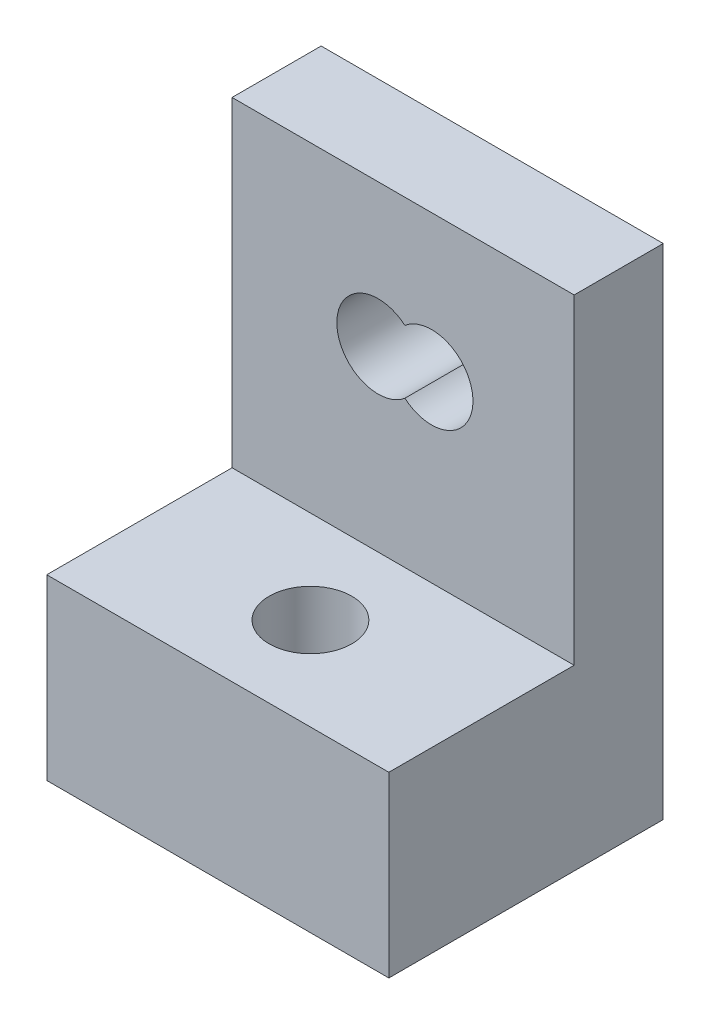
ISO-10303-21;
HEADER;
FILE_DESCRIPTION(('STEP AP214'),'2;1');
FILE_NAME('part.step','',(''),(''),'','','');
FILE_SCHEMA(('AUTOMOTIVE_DESIGN { 1 0 10303 214 1 1 1 1 }'));
ENDSEC;
DATA;
#1=APPLICATION_CONTEXT('core data for automotive mechanical design processes');
#2=APPLICATION_PROTOCOL_DEFINITION('international standard','automotive_design',2000,#1);
#3=PRODUCT_CONTEXT('',#1,'mechanical');
#4=PRODUCT('Part','Part','',(#3));
#5=PRODUCT_RELATED_PRODUCT_CATEGORY('part','',(#4));
#6=PRODUCT_DEFINITION_FORMATION('','',#4);
#7=PRODUCT_DEFINITION_CONTEXT('part definition',#1,'design');
#8=PRODUCT_DEFINITION('design','',#6,#7);
#9=PRODUCT_DEFINITION_SHAPE('','',#8);
#10=(LENGTH_UNIT() NAMED_UNIT(*) SI_UNIT(.MILLI.,.METRE.));
#11=(NAMED_UNIT(*) PLANE_ANGLE_UNIT() SI_UNIT($,.RADIAN.));
#12=(NAMED_UNIT(*) SI_UNIT($,.STERADIAN.) SOLID_ANGLE_UNIT());
#13=UNCERTAINTY_MEASURE_WITH_UNIT(LENGTH_MEASURE(1.E-05),#10,'distance_accuracy_value','');
#14=(GEOMETRIC_REPRESENTATION_CONTEXT(3) GLOBAL_UNCERTAINTY_ASSIGNED_CONTEXT((#13)) GLOBAL_UNIT_ASSIGNED_CONTEXT((#10,
#11,#12)) REPRESENTATION_CONTEXT('',''));
#15=CARTESIAN_POINT('',(0.,0.,0.));
#16=DIRECTION('',(0.,0.,1.));
#17=DIRECTION('',(1.,0.,0.));
#18=AXIS2_PLACEMENT_3D('',#15,#16,#17);
#19=CARTESIAN_POINT('',(0.,6.35,0.));
#20=DIRECTION('',(0.,-1.,0.));
#21=DIRECTION('',(0.,0.,-1.));
#22=AXIS2_PLACEMENT_3D('',#19,#20,#21);
#23=PLANE('',#22);
#24=CARTESIAN_POINT('',(6.096,6.35,-3.302));
#25=DIRECTION('',(0.,1.,0.));
#26=DIRECTION('',(0.,0.,1.));
#27=AXIS2_PLACEMENT_3D('',#24,#25,#26);
#28=CIRCLE('',#27,1.4732);
#29=CARTESIAN_POINT('',(6.096,6.35,-1.8288));
#30=VERTEX_POINT('',#29);
#31=EDGE_CURVE('E130',#30,#30,#28,.T.);
#32=ORIENTED_EDGE('',*,*,#31,.F.);
#33=EDGE_LOOP('',(#32));
#34=FACE_BOUND('',#33,.T.);
#35=DIRECTION('',(1.,0.,0.));
#36=VECTOR('',#35,1.);
#37=CARTESIAN_POINT('',(0.,6.35,-6.604));
#38=LINE('',#37,#36);
#39=CARTESIAN_POINT('',(0.,6.35,-6.604));
#40=VERTEX_POINT('',#39);
#41=CARTESIAN_POINT('',(12.192,6.35,-6.604));
#42=VERTEX_POINT('',#41);
#43=EDGE_CURVE('E70',#40,#42,#38,.T.);
#44=ORIENTED_EDGE('',*,*,#43,.F.);
#45=DIRECTION('',(0.,0.,1.));
#46=VECTOR('',#45,1.);
#47=CARTESIAN_POINT('',(0.,6.35,0.));
#48=LINE('',#47,#46);
#49=CARTESIAN_POINT('',(0.,6.35,0.));
#50=VERTEX_POINT('',#49);
#51=EDGE_CURVE('E154',#40,#50,#48,.T.);
#52=ORIENTED_EDGE('',*,*,#51,.T.);
#53=DIRECTION('',(1.,0.,0.));
#54=VECTOR('',#53,1.);
#55=CARTESIAN_POINT('',(0.,6.35,0.));
#56=LINE('',#55,#54);
#57=CARTESIAN_POINT('',(12.192,6.35,0.));
#58=VERTEX_POINT('',#57);
#59=EDGE_CURVE('E156',#50,#58,#56,.T.);
#60=ORIENTED_EDGE('',*,*,#59,.T.);
#61=DIRECTION('',(0.,0.,-1.));
#62=VECTOR('',#61,1.);
#63=CARTESIAN_POINT('',(12.192,6.35,0.));
#64=LINE('',#63,#62);
#65=EDGE_CURVE('E159',#58,#42,#64,.T.);
#66=ORIENTED_EDGE('',*,*,#65,.T.);
#67=EDGE_LOOP('',(#44,#52,#60,#66));
#68=FACE_BOUND('',#67,.T.);
#69=ADVANCED_FACE('F47',(#34,#68),#23,.F.);
#70=CARTESIAN_POINT('',(0.,6.35,0.));
#71=DIRECTION('',(1.,0.,0.));
#72=DIRECTION('',(0.,0.,-1.));
#73=AXIS2_PLACEMENT_3D('',#70,#71,#72);
#74=PLANE('',#73);
#75=DIRECTION('',(0.,0.,1.));
#76=VECTOR('',#75,1.);
#77=CARTESIAN_POINT('',(0.,0.,0.));
#78=LINE('',#77,#76);
#79=CARTESIAN_POINT('',(0.,0.,-9.779));
#80=VERTEX_POINT('',#79);
#81=CARTESIAN_POINT('',(0.,0.,0.));
#82=VERTEX_POINT('',#81);
#83=EDGE_CURVE('E153',#80,#82,#78,.T.);
#84=ORIENTED_EDGE('',*,*,#83,.T.);
#85=DIRECTION('',(0.,-1.,0.));
#86=VECTOR('',#85,1.);
#87=CARTESIAN_POINT('',(0.,6.35,0.));
#88=LINE('',#87,#86);
#89=EDGE_CURVE('E116',#50,#82,#88,.T.);
#90=ORIENTED_EDGE('',*,*,#89,.F.);
#91=ORIENTED_EDGE('',*,*,#51,.F.);
#92=DIRECTION('',(0.,-1.,0.));
#93=VECTOR('',#92,1.);
#94=CARTESIAN_POINT('',(0.,17.78,-6.604));
#95=LINE('',#94,#93);
#96=CARTESIAN_POINT('',(0.,17.78,-6.604));
#97=VERTEX_POINT('',#96);
#98=EDGE_CURVE('E150',#97,#40,#95,.T.);
#99=ORIENTED_EDGE('',*,*,#98,.F.);
#100=DIRECTION('',(0.,0.,1.));
#101=VECTOR('',#100,1.);
#102=CARTESIAN_POINT('',(0.,17.78,-9.779));
#103=LINE('',#102,#101);
#104=CARTESIAN_POINT('',(0.,17.78,-9.779));
#105=VERTEX_POINT('',#104);
#106=EDGE_CURVE('E135',#105,#97,#103,.T.);
#107=ORIENTED_EDGE('',*,*,#106,.F.);
#108=DIRECTION('',(0.,-1.,0.));
#109=VECTOR('',#108,1.);
#110=CARTESIAN_POINT('',(0.,6.35,-9.779));
#111=LINE('',#110,#109);
#112=EDGE_CURVE('E161',#105,#80,#111,.T.);
#113=ORIENTED_EDGE('',*,*,#112,.T.);
#114=EDGE_LOOP('',(#84,#90,#91,#99,#107,#113));
#115=FACE_BOUND('',#114,.T.);
#116=ADVANCED_FACE('F49',(#115),#74,.F.);
#117=CARTESIAN_POINT('',(0.,6.35,0.));
#118=DIRECTION('',(0.,0.,-1.));
#119=DIRECTION('',(-1.,0.,0.));
#120=AXIS2_PLACEMENT_3D('',#117,#118,#119);
#121=PLANE('',#120);
#122=DIRECTION('',(1.,0.,0.));
#123=VECTOR('',#122,1.);
#124=CARTESIAN_POINT('',(0.,0.,0.));
#125=LINE('',#124,#123);
#126=CARTESIAN_POINT('',(12.192,0.,0.));
#127=VERTEX_POINT('',#126);
#128=EDGE_CURVE('E164',#82,#127,#125,.T.);
#129=ORIENTED_EDGE('',*,*,#128,.T.);
#130=DIRECTION('',(0.,-1.,0.));
#131=VECTOR('',#130,1.);
#132=CARTESIAN_POINT('',(12.192,6.35,0.));
#133=LINE('',#132,#131);
#134=EDGE_CURVE('E174',#58,#127,#133,.T.);
#135=ORIENTED_EDGE('',*,*,#134,.F.);
#136=ORIENTED_EDGE('',*,*,#59,.F.);
#137=ORIENTED_EDGE('',*,*,#89,.T.);
#138=EDGE_LOOP('',(#129,#135,#136,#137));
#139=FACE_BOUND('',#138,.T.);
#140=ADVANCED_FACE('F181',(#139),#121,.F.);
#141=CARTESIAN_POINT('',(12.192,6.35,0.));
#142=DIRECTION('',(-1.,0.,0.));
#143=DIRECTION('',(0.,0.,1.));
#144=AXIS2_PLACEMENT_3D('',#141,#142,#143);
#145=PLANE('',#144);
#146=DIRECTION('',(0.,0.,-1.));
#147=VECTOR('',#146,1.);
#148=CARTESIAN_POINT('',(12.192,0.,0.));
#149=LINE('',#148,#147);
#150=CARTESIAN_POINT('',(12.192,0.,-9.779));
#151=VERTEX_POINT('',#150);
#152=EDGE_CURVE('E166',#127,#151,#149,.T.);
#153=ORIENTED_EDGE('',*,*,#152,.T.);
#154=DIRECTION('',(0.,-1.,0.));
#155=VECTOR('',#154,1.);
#156=CARTESIAN_POINT('',(12.192,6.35,-9.779));
#157=LINE('',#156,#155);
#158=CARTESIAN_POINT('',(12.192,17.78,-9.779));
#159=VERTEX_POINT('',#158);
#160=EDGE_CURVE('E171',#159,#151,#157,.T.);
#161=ORIENTED_EDGE('',*,*,#160,.F.);
#162=DIRECTION('',(0.,0.,-1.));
#163=VECTOR('',#162,1.);
#164=CARTESIAN_POINT('',(12.192,17.78,-9.779));
#165=LINE('',#164,#163);
#166=CARTESIAN_POINT('',(12.192,17.78,-6.604));
#167=VERTEX_POINT('',#166);
#168=EDGE_CURVE('E140',#167,#159,#165,.T.);
#169=ORIENTED_EDGE('',*,*,#168,.F.);
#170=DIRECTION('',(0.,-1.,0.));
#171=VECTOR('',#170,1.);
#172=CARTESIAN_POINT('',(12.192,17.78,-6.604));
#173=LINE('',#172,#171);
#174=EDGE_CURVE('E146',#167,#42,#173,.T.);
#175=ORIENTED_EDGE('',*,*,#174,.T.);
#176=ORIENTED_EDGE('',*,*,#65,.F.);
#177=ORIENTED_EDGE('',*,*,#134,.T.);
#178=EDGE_LOOP('',(#153,#161,#169,#175,#176,#177));
#179=FACE_BOUND('',#178,.T.);
#180=ADVANCED_FACE('F191',(#179),#145,.F.);
#181=CARTESIAN_POINT('',(0.,6.35,-9.779));
#182=DIRECTION('',(0.,0.,1.));
#183=DIRECTION('',(1.,0.,0.));
#184=AXIS2_PLACEMENT_3D('',#181,#182,#183);
#185=PLANE('',#184);
#186=CARTESIAN_POINT('',(5.20700000000436,12.6999999999921,-9.779));
#187=DIRECTION('',(0.,0.,-1.));
#188=DIRECTION('',(-1.,0.,0.));
#189=AXIS2_PLACEMENT_3D('',#186,#187,#188);
#190=CIRCLE('',#189,1.4732);
#191=CARTESIAN_POINT('',(6.1595000000038,11.576139692836,-9.779));
#192=VERTEX_POINT('',#191);
#193=CARTESIAN_POINT('',(6.1595000000051,13.8238603071471,-9.779));
#194=VERTEX_POINT('',#193);
#195=EDGE_CURVE('E121',#192,#194,#190,.T.);
#196=ORIENTED_EDGE('',*,*,#195,.F.);
#197=CARTESIAN_POINT('',(7.11200000000454,12.699999999991,-9.779));
#198=DIRECTION('',(0.,0.,-1.));
#199=DIRECTION('',(-1.,0.,0.));
#200=AXIS2_PLACEMENT_3D('',#197,#198,#199);
#201=CIRCLE('',#200,1.4732);
#202=EDGE_CURVE('E111',#194,#192,#201,.T.);
#203=ORIENTED_EDGE('',*,*,#202,.F.);
#204=EDGE_LOOP('',(#196,#203));
#205=FACE_BOUND('',#204,.T.);
#206=DIRECTION('',(-1.,0.,0.));
#207=VECTOR('',#206,1.);
#208=CARTESIAN_POINT('',(0.,0.,-9.779));
#209=LINE('',#208,#207);
#210=EDGE_CURVE('E157',#151,#80,#209,.T.);
#211=ORIENTED_EDGE('',*,*,#210,.T.);
#212=ORIENTED_EDGE('',*,*,#112,.F.);
#213=DIRECTION('',(-1.,0.,0.));
#214=VECTOR('',#213,1.);
#215=CARTESIAN_POINT('',(0.,17.78,-9.779));
#216=LINE('',#215,#214);
#217=EDGE_CURVE('E143',#159,#105,#216,.T.);
#218=ORIENTED_EDGE('',*,*,#217,.F.);
#219=ORIENTED_EDGE('',*,*,#160,.T.);
#220=EDGE_LOOP('',(#211,#212,#218,#219));
#221=FACE_BOUND('',#220,.T.);
#222=ADVANCED_FACE('F119',(#205,#221),#185,.F.);
#223=CARTESIAN_POINT('',(0.,0.,0.));
#224=DIRECTION('',(0.,-1.,0.));
#225=DIRECTION('',(0.,0.,-1.));
#226=AXIS2_PLACEMENT_3D('',#223,#224,#225);
#227=PLANE('',#226);
#228=CARTESIAN_POINT('',(6.096,0.,-3.302));
#229=DIRECTION('',(0.,1.,0.));
#230=DIRECTION('',(0.,0.,1.));
#231=AXIS2_PLACEMENT_3D('',#228,#229,#230);
#232=CIRCLE('',#231,1.4732);
#233=CARTESIAN_POINT('',(6.096,0.,-1.8288));
#234=VERTEX_POINT('',#233);
#235=EDGE_CURVE('E126',#234,#234,#232,.T.);
#236=ORIENTED_EDGE('',*,*,#235,.T.);
#237=EDGE_LOOP('',(#236));
#238=FACE_BOUND('',#237,.T.);
#239=ORIENTED_EDGE('',*,*,#83,.F.);
#240=ORIENTED_EDGE('',*,*,#210,.F.);
#241=ORIENTED_EDGE('',*,*,#152,.F.);
#242=ORIENTED_EDGE('',*,*,#128,.F.);
#243=EDGE_LOOP('',(#239,#240,#241,#242));
#244=FACE_BOUND('',#243,.T.);
#245=ADVANCED_FACE('F188',(#238,#244),#227,.T.);
#246=CARTESIAN_POINT('',(0.,17.78,-6.604));
#247=DIRECTION('',(0.,0.,-1.));
#248=DIRECTION('',(-1.,0.,0.));
#249=AXIS2_PLACEMENT_3D('',#246,#247,#248);
#250=PLANE('',#249);
#251=CARTESIAN_POINT('',(5.20700000000436,12.6999999999921,-6.604));
#252=DIRECTION('',(0.,0.,-1.));
#253=DIRECTION('',(-1.,0.,0.));
#254=AXIS2_PLACEMENT_3D('',#251,#252,#253);
#255=CIRCLE('',#254,1.4732);
#256=CARTESIAN_POINT('',(6.1595000000038,11.576139692836,-6.604));
#257=VERTEX_POINT('',#256);
#258=CARTESIAN_POINT('',(6.1595000000051,13.8238603071471,-6.604));
#259=VERTEX_POINT('',#258);
#260=EDGE_CURVE('E124',#257,#259,#255,.T.);
#261=ORIENTED_EDGE('',*,*,#260,.T.);
#262=CARTESIAN_POINT('',(7.11200000000454,12.699999999991,-6.604));
#263=DIRECTION('',(0.,0.,-1.));
#264=DIRECTION('',(-1.,0.,0.));
#265=AXIS2_PLACEMENT_3D('',#262,#263,#264);
#266=CIRCLE('',#265,1.4732);
#267=EDGE_CURVE('E62',#259,#257,#266,.T.);
#268=ORIENTED_EDGE('',*,*,#267,.T.);
#269=EDGE_LOOP('',(#261,#268));
#270=FACE_BOUND('',#269,.T.);
#271=ORIENTED_EDGE('',*,*,#43,.T.);
#272=ORIENTED_EDGE('',*,*,#174,.F.);
#273=DIRECTION('',(1.,0.,0.));
#274=VECTOR('',#273,1.);
#275=CARTESIAN_POINT('',(0.,17.78,-6.604));
#276=LINE('',#275,#274);
#277=EDGE_CURVE('E138',#97,#167,#276,.T.);
#278=ORIENTED_EDGE('',*,*,#277,.F.);
#279=ORIENTED_EDGE('',*,*,#98,.T.);
#280=EDGE_LOOP('',(#271,#272,#278,#279));
#281=FACE_BOUND('',#280,.T.);
#282=ADVANCED_FACE('F199',(#270,#281),#250,.F.);
#283=CARTESIAN_POINT('',(0.,17.78,0.));
#284=DIRECTION('',(0.,1.,0.));
#285=DIRECTION('',(0.,0.,1.));
#286=AXIS2_PLACEMENT_3D('',#283,#284,#285);
#287=PLANE('',#286);
#288=ORIENTED_EDGE('',*,*,#106,.T.);
#289=ORIENTED_EDGE('',*,*,#277,.T.);
#290=ORIENTED_EDGE('',*,*,#168,.T.);
#291=ORIENTED_EDGE('',*,*,#217,.T.);
#292=EDGE_LOOP('',(#288,#289,#290,#291));
#293=FACE_BOUND('',#292,.T.);
#294=ADVANCED_FACE('F196',(#293),#287,.T.);
#295=CARTESIAN_POINT('',(6.096,0.,-3.302));
#296=DIRECTION('',(0.,1.,0.));
#297=DIRECTION('',(0.,0.,1.));
#298=AXIS2_PLACEMENT_3D('',#295,#296,#297);
#299=CYLINDRICAL_SURFACE('',#298,1.4732);
#300=ORIENTED_EDGE('',*,*,#235,.F.);
#301=EDGE_LOOP('',(#300));
#302=FACE_BOUND('',#301,.T.);
#303=ORIENTED_EDGE('',*,*,#31,.T.);
#304=EDGE_LOOP('',(#303));
#305=FACE_BOUND('',#304,.T.);
#306=ADVANCED_FACE('F238',(#302,#305),#299,.F.);
#307=CARTESIAN_POINT('',(5.20700000000436,12.6999999999921,-3.429));
#308=DIRECTION('',(0.,0.,-1.));
#309=DIRECTION('',(-1.,0.,0.));
#310=AXIS2_PLACEMENT_3D('',#307,#308,#309);
#311=CYLINDRICAL_SURFACE('',#310,1.4732);
#312=ORIENTED_EDGE('',*,*,#260,.F.);
#313=DIRECTION('',(0.,0.,-1.));
#314=VECTOR('',#313,1.);
#315=CARTESIAN_POINT('',(6.1595000000038,11.576139692836,-6.604));
#316=LINE('',#315,#314);
#317=EDGE_CURVE('E11',#257,#192,#316,.T.);
#318=ORIENTED_EDGE('',*,*,#317,.T.);
#319=ORIENTED_EDGE('',*,*,#195,.T.);
#320=DIRECTION('',(0.,0.,-1.));
#321=VECTOR('',#320,1.);
#322=CARTESIAN_POINT('',(6.1595000000051,13.8238603071471,-6.604));
#323=LINE('',#322,#321);
#324=EDGE_CURVE('E55',#194,#259,#323,.F.);
#325=ORIENTED_EDGE('',*,*,#324,.T.);
#326=EDGE_LOOP('',(#312,#318,#319,#325));
#327=FACE_BOUND('',#326,.T.);
#328=ADVANCED_FACE('F123',(#327),#311,.F.);
#329=CARTESIAN_POINT('',(7.11200000000454,12.699999999991,-3.429));
#330=DIRECTION('',(0.,0.,-1.));
#331=DIRECTION('',(-1.,0.,0.));
#332=AXIS2_PLACEMENT_3D('',#329,#330,#331);
#333=CYLINDRICAL_SURFACE('',#332,1.4732);
#334=ORIENTED_EDGE('',*,*,#267,.F.);
#335=ORIENTED_EDGE('',*,*,#324,.F.);
#336=ORIENTED_EDGE('',*,*,#202,.T.);
#337=ORIENTED_EDGE('',*,*,#317,.F.);
#338=EDGE_LOOP('',(#334,#335,#336,#337));
#339=FACE_BOUND('',#338,.T.);
#340=ADVANCED_FACE('F110',(#339),#333,.F.);
#341=CLOSED_SHELL('',(#69,#116,#140,#180,#222,#245,#282,#294,#306,#328,#340));
#342=MANIFOLD_SOLID_BREP('B2',#341);
#343=ADVANCED_BREP_SHAPE_REPRESENTATION('',(#18,#342),#14);
#344=SHAPE_DEFINITION_REPRESENTATION(#9,#343);
ENDSEC;
END-ISO-10303-21;
